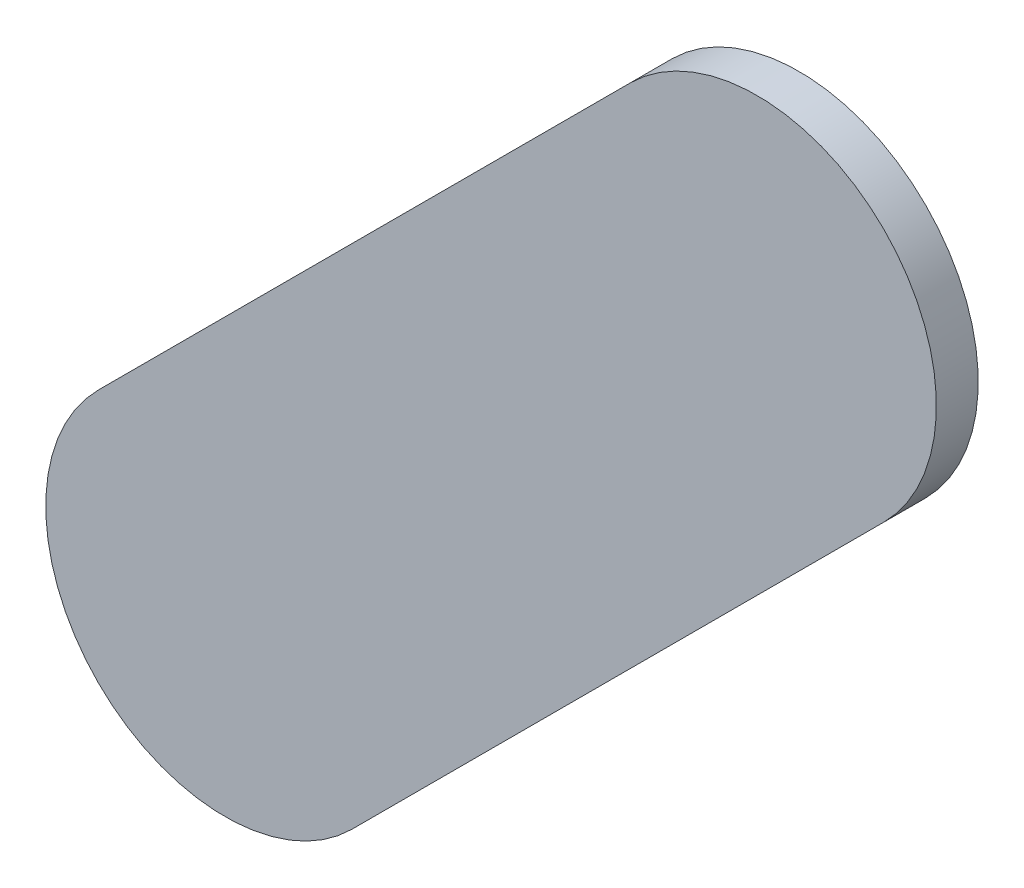
ISO-10303-21;
HEADER;
FILE_DESCRIPTION(('STEP AP214'),'2;1');
FILE_NAME('part.step','',(''),(''),'','','');
FILE_SCHEMA(('AUTOMOTIVE_DESIGN { 1 0 10303 214 1 1 1 1 }'));
ENDSEC;
DATA;
#1=APPLICATION_CONTEXT('core data for automotive mechanical design processes');
#2=APPLICATION_PROTOCOL_DEFINITION('international standard','automotive_design',2000,#1);
#3=PRODUCT_CONTEXT('',#1,'mechanical');
#4=PRODUCT('Part','Part','',(#3));
#5=PRODUCT_RELATED_PRODUCT_CATEGORY('part','',(#4));
#6=PRODUCT_DEFINITION_FORMATION('','',#4);
#7=PRODUCT_DEFINITION_CONTEXT('part definition',#1,'design');
#8=PRODUCT_DEFINITION('design','',#6,#7);
#9=PRODUCT_DEFINITION_SHAPE('','',#8);
#10=(LENGTH_UNIT() NAMED_UNIT(*) SI_UNIT(.MILLI.,.METRE.));
#11=(NAMED_UNIT(*) PLANE_ANGLE_UNIT() SI_UNIT($,.RADIAN.));
#12=(NAMED_UNIT(*) SI_UNIT($,.STERADIAN.) SOLID_ANGLE_UNIT());
#13=UNCERTAINTY_MEASURE_WITH_UNIT(LENGTH_MEASURE(1.E-05),#10,'distance_accuracy_value','');
#14=(GEOMETRIC_REPRESENTATION_CONTEXT(3) GLOBAL_UNCERTAINTY_ASSIGNED_CONTEXT((#13)) GLOBAL_UNIT_ASSIGNED_CONTEXT((#10,
#11,#12)) REPRESENTATION_CONTEXT('',''));
#15=CARTESIAN_POINT('',(0.,0.,0.));
#16=DIRECTION('',(0.,0.,1.));
#17=DIRECTION('',(1.,0.,0.));
#18=AXIS2_PLACEMENT_3D('',#15,#16,#17);
#19=CARTESIAN_POINT('',(89.286066,-115.206066,1.635));
#20=DIRECTION('',(0.,0.,1.));
#21=DIRECTION('',(1.,0.,0.));
#22=AXIS2_PLACEMENT_3D('',#19,#20,#21);
#23=PLANE('',#22);
#24=DIRECTION('',(0.707106781186548,0.707106781186548,0.));
#25=VECTOR('',#24,1.);
#26=CARTESIAN_POINT('',(89.286066,-115.206066,1.635));
#27=LINE('',#26,#25);
#28=CARTESIAN_POINT('',(89.286066,-115.206066,1.635));
#29=VERTEX_POINT('',#28);
#30=CARTESIAN_POINT('',(89.731066,-114.761066,1.635));
#31=VERTEX_POINT('',#30);
#32=EDGE_CURVE('E96',#29,#31,#27,.T.);
#33=ORIENTED_EDGE('',*,*,#32,.T.);
#34=CARTESIAN_POINT('',(89.6249995,-114.6549995,1.635));
#35=DIRECTION('',(0.,0.,1.));
#36=DIRECTION('',(0.707106781186548,-0.707106781186548,0.));
#37=AXIS2_PLACEMENT_3D('',#34,#35,#36);
#38=CIRCLE('',#37,0.150000682813);
#39=CARTESIAN_POINT('',(89.518933,-114.548933,1.635));
#40=VERTEX_POINT('',#39);
#41=EDGE_CURVE('E76',#31,#40,#38,.T.);
#42=ORIENTED_EDGE('',*,*,#41,.T.);
#43=DIRECTION('',(-0.707106781186548,-0.707106781186548,0.));
#44=VECTOR('',#43,1.);
#45=CARTESIAN_POINT('',(89.518933,-114.548933,1.635));
#46=LINE('',#45,#44);
#47=CARTESIAN_POINT('',(89.073933,-114.993933,1.635));
#48=VERTEX_POINT('',#47);
#49=EDGE_CURVE('E80',#40,#48,#46,.T.);
#50=ORIENTED_EDGE('',*,*,#49,.T.);
#51=CARTESIAN_POINT('',(89.1799995,-115.0999995,1.635));
#52=DIRECTION('',(0.,0.,1.));
#53=DIRECTION('',(-0.707106781186548,0.707106781186548,0.));
#54=AXIS2_PLACEMENT_3D('',#51,#52,#53);
#55=CIRCLE('',#54,0.150000682813);
#56=EDGE_CURVE('E11',#48,#29,#55,.T.);
#57=ORIENTED_EDGE('',*,*,#56,.T.);
#58=EDGE_LOOP('',(#33,#42,#50,#57));
#59=FACE_BOUND('',#58,.T.);
#60=ADVANCED_FACE('F17',(#59),#23,.T.);
#61=CARTESIAN_POINT('',(89.286066,-115.206066,1.6));
#62=DIRECTION('',(0.,0.,1.));
#63=DIRECTION('',(1.,0.,0.));
#64=AXIS2_PLACEMENT_3D('',#61,#62,#63);
#65=PLANE('',#64);
#66=CARTESIAN_POINT('',(89.1799995,-115.0999995,1.6));
#67=DIRECTION('',(0.,0.,1.));
#68=DIRECTION('',(-0.707106781186548,0.707106781186548,0.));
#69=AXIS2_PLACEMENT_3D('',#66,#67,#68);
#70=CIRCLE('',#69,0.150000682813);
#71=CARTESIAN_POINT('',(89.073933,-114.993933,1.6));
#72=VERTEX_POINT('',#71);
#73=CARTESIAN_POINT('',(89.286066,-115.206066,1.6));
#74=VERTEX_POINT('',#73);
#75=EDGE_CURVE('E21',#72,#74,#70,.T.);
#76=ORIENTED_EDGE('',*,*,#75,.F.);
#77=DIRECTION('',(-0.707106781186548,-0.707106781186548,0.));
#78=VECTOR('',#77,1.);
#79=CARTESIAN_POINT('',(89.518933,-114.548933,1.6));
#80=LINE('',#79,#78);
#81=CARTESIAN_POINT('',(89.518933,-114.548933,1.6));
#82=VERTEX_POINT('',#81);
#83=EDGE_CURVE('E66',#82,#72,#80,.T.);
#84=ORIENTED_EDGE('',*,*,#83,.F.);
#85=CARTESIAN_POINT('',(89.6249995,-114.6549995,1.6));
#86=DIRECTION('',(0.,0.,1.));
#87=DIRECTION('',(0.707106781186548,-0.707106781186548,0.));
#88=AXIS2_PLACEMENT_3D('',#85,#86,#87);
#89=CIRCLE('',#88,0.150000682813);
#90=CARTESIAN_POINT('',(89.731066,-114.761066,1.6));
#91=VERTEX_POINT('',#90);
#92=EDGE_CURVE('E70',#91,#82,#89,.T.);
#93=ORIENTED_EDGE('',*,*,#92,.F.);
#94=DIRECTION('',(0.707106781186548,0.707106781186548,0.));
#95=VECTOR('',#94,1.);
#96=CARTESIAN_POINT('',(89.286066,-115.206066,1.6));
#97=LINE('',#96,#95);
#98=EDGE_CURVE('E114',#74,#91,#97,.T.);
#99=ORIENTED_EDGE('',*,*,#98,.F.);
#100=EDGE_LOOP('',(#76,#84,#93,#99));
#101=FACE_BOUND('',#100,.T.);
#102=ADVANCED_FACE('F68',(#101),#65,.F.);
#103=CARTESIAN_POINT('',(89.1799995,-115.0999995,1.6));
#104=DIRECTION('',(0.,0.,-1.));
#105=DIRECTION('',(-0.707106781186548,0.707106781186548,0.));
#106=AXIS2_PLACEMENT_3D('',#103,#104,#105);
#107=CYLINDRICAL_SURFACE('',#106,0.150000682813);
#108=ORIENTED_EDGE('',*,*,#75,.T.);
#109=DIRECTION('',(0.,0.,1.));
#110=VECTOR('',#109,1.);
#111=CARTESIAN_POINT('',(89.286066,-115.206066,1.6));
#112=LINE('',#111,#110);
#113=EDGE_CURVE('E90',#74,#29,#112,.T.);
#114=ORIENTED_EDGE('',*,*,#113,.T.);
#115=ORIENTED_EDGE('',*,*,#56,.F.);
#116=DIRECTION('',(0.,0.,1.));
#117=VECTOR('',#116,1.);
#118=CARTESIAN_POINT('',(89.073933,-114.993933,1.6));
#119=LINE('',#118,#117);
#120=EDGE_CURVE('E75',#72,#48,#119,.T.);
#121=ORIENTED_EDGE('',*,*,#120,.F.);
#122=EDGE_LOOP('',(#108,#114,#115,#121));
#123=FACE_BOUND('',#122,.T.);
#124=ADVANCED_FACE('F19',(#123),#107,.T.);
#125=CARTESIAN_POINT('',(89.518933,-114.548933,1.6));
#126=DIRECTION('',(0.707106781186548,-0.707106781186548,0.));
#127=DIRECTION('',(0.,0.,-1.));
#128=AXIS2_PLACEMENT_3D('',#125,#126,#127);
#129=PLANE('',#128);
#130=ORIENTED_EDGE('',*,*,#83,.T.);
#131=ORIENTED_EDGE('',*,*,#120,.T.);
#132=ORIENTED_EDGE('',*,*,#49,.F.);
#133=DIRECTION('',(0.,0.,1.));
#134=VECTOR('',#133,1.);
#135=CARTESIAN_POINT('',(89.518933,-114.548933,1.6));
#136=LINE('',#135,#134);
#137=EDGE_CURVE('E78',#82,#40,#136,.T.);
#138=ORIENTED_EDGE('',*,*,#137,.F.);
#139=EDGE_LOOP('',(#130,#131,#132,#138));
#140=FACE_BOUND('',#139,.T.);
#141=ADVANCED_FACE('F79',(#140),#129,.F.);
#142=CARTESIAN_POINT('',(89.6249995,-114.6549995,1.6));
#143=DIRECTION('',(0.,0.,-1.));
#144=DIRECTION('',(0.707106781186548,-0.707106781186548,0.));
#145=AXIS2_PLACEMENT_3D('',#142,#143,#144);
#146=CYLINDRICAL_SURFACE('',#145,0.150000682813);
#147=ORIENTED_EDGE('',*,*,#92,.T.);
#148=ORIENTED_EDGE('',*,*,#137,.T.);
#149=ORIENTED_EDGE('',*,*,#41,.F.);
#150=DIRECTION('',(0.,0.,1.));
#151=VECTOR('',#150,1.);
#152=CARTESIAN_POINT('',(89.731066,-114.761066,1.6));
#153=LINE('',#152,#151);
#154=EDGE_CURVE('E87',#91,#31,#153,.T.);
#155=ORIENTED_EDGE('',*,*,#154,.F.);
#156=EDGE_LOOP('',(#147,#148,#149,#155));
#157=FACE_BOUND('',#156,.T.);
#158=ADVANCED_FACE('F85',(#157),#146,.T.);
#159=CARTESIAN_POINT('',(89.286066,-115.206066,1.6));
#160=DIRECTION('',(-0.707106781186548,0.707106781186548,0.));
#161=DIRECTION('',(0.,0.,1.));
#162=AXIS2_PLACEMENT_3D('',#159,#160,#161);
#163=PLANE('',#162);
#164=ORIENTED_EDGE('',*,*,#98,.T.);
#165=ORIENTED_EDGE('',*,*,#154,.T.);
#166=ORIENTED_EDGE('',*,*,#32,.F.);
#167=ORIENTED_EDGE('',*,*,#113,.F.);
#168=EDGE_LOOP('',(#164,#165,#166,#167));
#169=FACE_BOUND('',#168,.T.);
#170=ADVANCED_FACE('F113',(#169),#163,.F.);
#171=CLOSED_SHELL('',(#60,#102,#124,#141,#158,#170));
#172=MANIFOLD_SOLID_BREP('B1',#171);
#173=ADVANCED_BREP_SHAPE_REPRESENTATION('',(#18,#172),#14);
#174=SHAPE_DEFINITION_REPRESENTATION(#9,#173);
ENDSEC;
END-ISO-10303-21;
